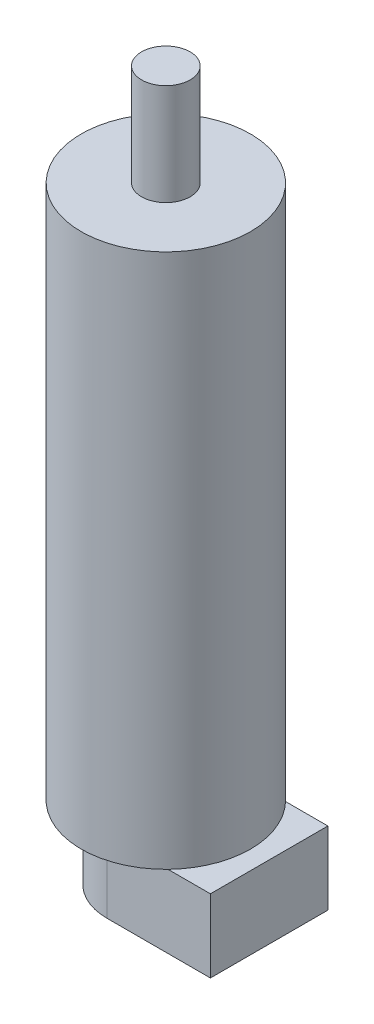
ISO-10303-21;
HEADER;
FILE_DESCRIPTION(('STEP AP214'),'2;1');
FILE_NAME('part.step','',(''),(''),'','','');
FILE_SCHEMA(('AUTOMOTIVE_DESIGN { 1 0 10303 214 1 1 1 1 }'));
ENDSEC;
DATA;
#1=APPLICATION_CONTEXT('core data for automotive mechanical design processes');
#2=APPLICATION_PROTOCOL_DEFINITION('international standard','automotive_design',2000,#1);
#3=PRODUCT_CONTEXT('',#1,'mechanical');
#4=PRODUCT('Part','Part','',(#3));
#5=PRODUCT_RELATED_PRODUCT_CATEGORY('part','',(#4));
#6=PRODUCT_DEFINITION_FORMATION('','',#4);
#7=PRODUCT_DEFINITION_CONTEXT('part definition',#1,'design');
#8=PRODUCT_DEFINITION('design','',#6,#7);
#9=PRODUCT_DEFINITION_SHAPE('','',#8);
#10=(LENGTH_UNIT() NAMED_UNIT(*) SI_UNIT(.MILLI.,.METRE.));
#11=(NAMED_UNIT(*) PLANE_ANGLE_UNIT() SI_UNIT($,.RADIAN.));
#12=(NAMED_UNIT(*) SI_UNIT($,.STERADIAN.) SOLID_ANGLE_UNIT());
#13=UNCERTAINTY_MEASURE_WITH_UNIT(LENGTH_MEASURE(1.E-05),#10,'distance_accuracy_value','');
#14=(GEOMETRIC_REPRESENTATION_CONTEXT(3) GLOBAL_UNCERTAINTY_ASSIGNED_CONTEXT((#13)) GLOBAL_UNIT_ASSIGNED_CONTEXT((#10,
#11,#12)) REPRESENTATION_CONTEXT('',''));
#15=CARTESIAN_POINT('',(0.,0.,0.));
#16=DIRECTION('',(0.,0.,1.));
#17=DIRECTION('',(1.,0.,0.));
#18=AXIS2_PLACEMENT_3D('',#15,#16,#17);
#19=CARTESIAN_POINT('',(-4.,-22.5,0.));
#20=DIRECTION('',(1.,0.,0.));
#21=DIRECTION('',(0.,0.,-1.));
#22=AXIS2_PLACEMENT_3D('',#19,#20,#21);
#23=PLANE('',#22);
#24=DIRECTION('',(0.,1.,0.));
#25=VECTOR('',#24,1.);
#26=CARTESIAN_POINT('',(-4.,-12.5,2.));
#27=LINE('',#26,#25);
#28=CARTESIAN_POINT('',(-4.,-20.5,2.));
#29=VERTEX_POINT('',#28);
#30=CARTESIAN_POINT('',(-4.,-4.5,2.));
#31=VERTEX_POINT('',#30);
#32=EDGE_CURVE('E99',#29,#31,#27,.T.);
#33=ORIENTED_EDGE('',*,*,#32,.T.);
#34=CARTESIAN_POINT('',(-4.,-4.5,0.));
#35=DIRECTION('',(-1.,0.,0.));
#36=DIRECTION('',(0.,0.,1.));
#37=AXIS2_PLACEMENT_3D('',#34,#35,#36);
#38=CIRCLE('',#37,2.);
#39=CARTESIAN_POINT('',(-4.,-4.5,-2.));
#40=VERTEX_POINT('',#39);
#41=EDGE_CURVE('E142',#31,#40,#38,.T.);
#42=ORIENTED_EDGE('',*,*,#41,.T.);
#43=DIRECTION('',(0.,1.,0.));
#44=VECTOR('',#43,1.);
#45=CARTESIAN_POINT('',(-4.,-12.5,-2.));
#46=LINE('',#45,#44);
#47=CARTESIAN_POINT('',(-4.,-20.5,-2.));
#48=VERTEX_POINT('',#47);
#49=EDGE_CURVE('E110',#48,#40,#46,.T.);
#50=ORIENTED_EDGE('',*,*,#49,.F.);
#51=CARTESIAN_POINT('',(-4.,-20.5,0.));
#52=DIRECTION('',(-1.,0.,0.));
#53=DIRECTION('',(0.,0.,1.));
#54=AXIS2_PLACEMENT_3D('',#51,#52,#53);
#55=CIRCLE('',#54,2.);
#56=EDGE_CURVE('E20',#48,#29,#55,.T.);
#57=ORIENTED_EDGE('',*,*,#56,.T.);
#58=EDGE_LOOP('',(#33,#42,#50,#57));
#59=FACE_BOUND('',#58,.T.);
#60=ADVANCED_FACE('F17',(#59),#23,.F.);
#61=CARTESIAN_POINT('',(8.04939564502272,-175.,0.));
#62=DIRECTION('',(0.,1.,0.));
#63=DIRECTION('',(0.,0.,1.));
#64=AXIS2_PLACEMENT_3D('',#61,#62,#63);
#65=PLANE('',#64);
#66=CARTESIAN_POINT('',(0.,-175.,0.));
#67=DIRECTION('',(0.,-1.,0.));
#68=DIRECTION('',(1.,0.,0.));
#69=AXIS2_PLACEMENT_3D('',#66,#67,#68);
#70=CIRCLE('',#69,14.5);
#71=CARTESIAN_POINT('',(0.,-175.,-14.5));
#72=VERTEX_POINT('',#71);
#73=CARTESIAN_POINT('',(0.,-175.,14.5));
#74=VERTEX_POINT('',#73);
#75=EDGE_CURVE('E272',#72,#74,#70,.F.);
#76=ORIENTED_EDGE('',*,*,#75,.F.);
#77=DIRECTION('',(-1.,0.,0.));
#78=VECTOR('',#77,1.);
#79=CARTESIAN_POINT('',(25.5,-175.,-14.5));
#80=LINE('',#79,#78);
#81=CARTESIAN_POINT('',(25.5,-175.,-14.5));
#82=VERTEX_POINT('',#81);
#83=EDGE_CURVE('E124',#82,#72,#80,.T.);
#84=ORIENTED_EDGE('',*,*,#83,.F.);
#85=DIRECTION('',(0.,0.,-1.));
#86=VECTOR('',#85,1.);
#87=CARTESIAN_POINT('',(25.5,-175.,14.5));
#88=LINE('',#87,#86);
#89=CARTESIAN_POINT('',(25.5,-175.,14.5));
#90=VERTEX_POINT('',#89);
#91=EDGE_CURVE('E136',#90,#82,#88,.T.);
#92=ORIENTED_EDGE('',*,*,#91,.F.);
#93=DIRECTION('',(1.,0.,0.));
#94=VECTOR('',#93,1.);
#95=CARTESIAN_POINT('',(0.,-175.,14.5));
#96=LINE('',#95,#94);
#97=EDGE_CURVE('E132',#74,#90,#96,.T.);
#98=ORIENTED_EDGE('',*,*,#97,.F.);
#99=EDGE_LOOP('',(#76,#84,#92,#98));
#100=FACE_BOUND('',#99,.T.);
#101=ADVANCED_FACE('F306',(#100),#65,.F.);
#102=CARTESIAN_POINT('',(-6.73306856241456,-12.5,2.));
#103=DIRECTION('',(0.,0.,1.));
#104=DIRECTION('',(1.,0.,0.));
#105=AXIS2_PLACEMENT_3D('',#102,#103,#104);
#106=PLANE('',#105);
#107=ORIENTED_EDGE('',*,*,#32,.F.);
#108=DIRECTION('',(-1.,0.,0.));
#109=VECTOR('',#108,1.);
#110=CARTESIAN_POINT('',(-8.09960284362183,-20.5,2.));
#111=LINE('',#110,#109);
#112=CARTESIAN_POINT('',(-5.65685424949237,-20.5,2.));
#113=VERTEX_POINT('',#112);
#114=EDGE_CURVE('E101',#29,#113,#111,.T.);
#115=ORIENTED_EDGE('',*,*,#114,.T.);
#116=DIRECTION('',(0.,-1.,0.));
#117=VECTOR('',#116,1.);
#118=CARTESIAN_POINT('',(-5.65685424949238,-12.5,2.));
#119=LINE('',#118,#117);
#120=CARTESIAN_POINT('',(-5.65685424949238,-4.5,2.));
#121=VERTEX_POINT('',#120);
#122=EDGE_CURVE('E264',#121,#113,#119,.T.);
#123=ORIENTED_EDGE('',*,*,#122,.F.);
#124=DIRECTION('',(-1.,0.,0.));
#125=VECTOR('',#124,1.);
#126=CARTESIAN_POINT('',(-5.36653428120728,-4.5,2.));
#127=LINE('',#126,#125);
#128=EDGE_CURVE('E104',#121,#31,#127,.F.);
#129=ORIENTED_EDGE('',*,*,#128,.T.);
#130=EDGE_LOOP('',(#107,#115,#123,#129));
#131=FACE_BOUND('',#130,.T.);
#132=ADVANCED_FACE('F100',(#131),#106,.F.);
#133=CARTESIAN_POINT('',(-8.09960284362183,-20.5,0.));
#134=DIRECTION('',(-1.,0.,0.));
#135=DIRECTION('',(0.,0.,1.));
#136=AXIS2_PLACEMENT_3D('',#133,#134,#135);
#137=CYLINDRICAL_SURFACE('',#136,2.);
#138=DIRECTION('',(1.,0.,0.));
#139=VECTOR('',#138,1.);
#140=CARTESIAN_POINT('',(-6.73306856241456,-20.5,-2.));
#141=LINE('',#140,#139);
#142=CARTESIAN_POINT('',(-5.65685424949237,-20.5,-2.));
#143=VERTEX_POINT('',#142);
#144=EDGE_CURVE('E113',#143,#48,#141,.T.);
#145=ORIENTED_EDGE('',*,*,#144,.F.);
#146=CARTESIAN_POINT('',(-5.65685424949237,-20.5,2.));
#147=CARTESIAN_POINT('',(-5.65684884179147,-20.554581043276,2.00000149375843));
#148=CARTESIAN_POINT('',(-5.65764520027123,-20.6091342237887,1.99776424451255));
#149=CARTESIAN_POINT('',(-5.66078655296454,-20.7178173659418,1.98885119435739));
#150=CARTESIAN_POINT('',(-5.66313112913611,-20.7719474378369,1.98217659159679));
#151=CARTESIAN_POINT('',(-5.67238186100911,-20.9327844796973,1.95562129980308));
#152=CARTESIAN_POINT('',(-5.68150585996211,-21.0383617859732,1.92920842248733));
#153=CARTESIAN_POINT('',(-5.70456166112211,-21.2432518654422,1.85991633491415));
#154=CARTESIAN_POINT('',(-5.71849088382529,-21.3425679659655,1.81704595785701));
#155=CARTESIAN_POINT('',(-5.74957624122923,-21.53268230939,1.71614472563144));
#156=CARTESIAN_POINT('',(-5.76673426277569,-21.623475524951,1.65810499804511));
#157=CARTESIAN_POINT('',(-5.80308799465943,-21.7974327100806,1.52610884181332));
#158=CARTESIAN_POINT('',(-5.82233419773289,-21.8802152014007,1.45166369414288));
#159=CARTESIAN_POINT('',(-5.86027369058978,-22.032399956906,1.28999145201007));
#160=CARTESIAN_POINT('',(-5.87896678315313,-22.1017974960141,1.20275986280909));
#161=CARTESIAN_POINT('',(-5.91428598942567,-22.2269881443538,1.01516592788934));
#162=CARTESIAN_POINT('',(-5.93084424167127,-22.2823722318204,0.914516988771549));
#163=CARTESIAN_POINT('',(-5.95940326071059,-22.3752206385709,0.704746567262076));
#164=CARTESIAN_POINT('',(-5.97140961667464,-22.4127069489016,0.595635674808582));
#165=CARTESIAN_POINT('',(-5.98683877140557,-22.4602475410318,0.405040536436658));
#166=CARTESIAN_POINT('',(-5.99174657627997,-22.475123920689,0.324846609487065));
#167=CARTESIAN_POINT('',(-5.99832834221425,-22.4950015875116,0.163111840880364));
#168=CARTESIAN_POINT('',(-6.00000248277622,-22.5000034228174,0.0815710742403433));
#169=CARTESIAN_POINT('',(-5.99999668076366,-22.4999954240178,-0.109052789280185));
#170=CARTESIAN_POINT('',(-5.99699670684628,-22.4910448732045,-0.218159747800598));
#171=CARTESIAN_POINT('',(-5.98531165061163,-22.4555629807985,-0.433213016519224));
#172=CARTESIAN_POINT('',(-5.97662173323894,-22.4290166869064,-0.539156558461215));
#173=CARTESIAN_POINT('',(-5.95450524812733,-22.3593590956721,-0.74466935491201));
#174=CARTESIAN_POINT('',(-5.94108809701935,-22.3162807150683,-0.84425082015528));
#175=CARTESIAN_POINT('',(-5.91088699350148,-22.2149108040547,-1.03476127570407));
#176=CARTESIAN_POINT('',(-5.89410277426667,-22.1566180678657,-1.12568957944319));
#177=CARTESIAN_POINT('',(-5.85828241386193,-22.0243504992917,-1.2994805717371));
#178=CARTESIAN_POINT('',(-5.83919229222969,-21.9499425405013,-1.38200242703585));
#179=CARTESIAN_POINT('',(-5.80120734240528,-21.7884700724964,-1.53366153903484));
#180=CARTESIAN_POINT('',(-5.78231256995808,-21.7014020518569,-1.60279506987144));
#181=CARTESIAN_POINT('',(-5.74626041003988,-21.5139988371862,-1.72767175144752));
#182=CARTESIAN_POINT('',(-5.72916954418607,-21.4133514041937,-1.78296692362324));
#183=CARTESIAN_POINT('',(-5.69949629987982,-21.2035601745916,-1.87566629037053));
#184=CARTESIAN_POINT('',(-5.68690937859231,-21.0944250750028,-1.91308852503714));
#185=CARTESIAN_POINT('',(-5.67072104665874,-20.9040027414,-1.96044949514537));
#186=CARTESIAN_POINT('',(-5.66556318486902,-20.8240239074553,-1.97524301676809));
#187=CARTESIAN_POINT('',(-5.65861074103287,-20.6627153694485,-1.99503214763902));
#188=CARTESIAN_POINT('',(-5.65681646587319,-20.5813855428074,-2.00002686286613));
#189=CARTESIAN_POINT('',(-5.65685424949237,-20.5,-2.));
#190=B_SPLINE_CURVE_WITH_KNOTS('',3,(#146,#147,#148,#149,#150,#151,#152,#153,#154,#155,#156,
#157,#158,#159,#160,#161,#162,#163,#164,#165,#166,#167,#168,#169,#170,#171,#172,#173,#174,#175,
#176,#177,#178,#179,#180,#181,#182,#183,#184,#185,#186,#187,#188,#189),.UNSPECIFIED.,.F.,.F.,(4,
2,2,2,2,2,2,2,2,2,2,2,2,2,2,2,2,2,2,2,2,4),(0.,0.16363711848162,0.327230070545711,
0.653162397592184,0.978920031678614,1.30486862655436,1.64230066113897,1.9798515968479,
2.32634313894962,2.67240784330359,2.91690557900246,3.16138974213691,3.48824187903641,
3.81537212111244,4.14185437137159,4.46836250409952,4.80507367423103,5.14187841415668,
5.48847983044704,5.83473066046781,6.07859129287806,6.32247417355028),.UNSPECIFIED.);
#191=EDGE_CURVE('E116',#113,#143,#190,.T.);
#192=ORIENTED_EDGE('',*,*,#191,.F.);
#193=ORIENTED_EDGE('',*,*,#114,.F.);
#194=ORIENTED_EDGE('',*,*,#56,.F.);
#195=EDGE_LOOP('',(#145,#192,#193,#194));
#196=FACE_BOUND('',#195,.T.);
#197=ADVANCED_FACE('F114',(#196),#137,.F.);
#198=CARTESIAN_POINT('',(-6.73306856241456,-12.5,-2.));
#199=DIRECTION('',(0.,0.,1.));
#200=DIRECTION('',(1.,0.,0.));
#201=AXIS2_PLACEMENT_3D('',#198,#199,#200);
#202=PLANE('',#201);
#203=DIRECTION('',(-1.,0.,0.));
#204=VECTOR('',#203,1.);
#205=CARTESIAN_POINT('',(-5.36653428120728,-4.5,-2.));
#206=LINE('',#205,#204);
#207=CARTESIAN_POINT('',(-5.65685424949238,-4.5,-2.));
#208=VERTEX_POINT('',#207);
#209=EDGE_CURVE('E146',#40,#208,#206,.T.);
#210=ORIENTED_EDGE('',*,*,#209,.T.);
#211=DIRECTION('',(0.,-1.,0.));
#212=VECTOR('',#211,1.);
#213=CARTESIAN_POINT('',(-5.65685424949238,-12.5,-2.));
#214=LINE('',#213,#212);
#215=EDGE_CURVE('E177',#143,#208,#214,.F.);
#216=ORIENTED_EDGE('',*,*,#215,.F.);
#217=ORIENTED_EDGE('',*,*,#144,.T.);
#218=ORIENTED_EDGE('',*,*,#49,.T.);
#219=EDGE_LOOP('',(#210,#216,#217,#218));
#220=FACE_BOUND('',#219,.T.);
#221=ADVANCED_FACE('F218',(#220),#202,.T.);
#222=CARTESIAN_POINT('',(-5.36653428120728,-4.5,0.));
#223=DIRECTION('',(-1.,0.,0.));
#224=DIRECTION('',(0.,0.,1.));
#225=AXIS2_PLACEMENT_3D('',#222,#223,#224);
#226=CYLINDRICAL_SURFACE('',#225,2.);
#227=ORIENTED_EDGE('',*,*,#128,.F.);
#228=CARTESIAN_POINT('',(-5.65685424949238,-4.5,-2.));
#229=CARTESIAN_POINT('',(-5.65684884179147,-4.44541895672398,-2.00000149375843));
#230=CARTESIAN_POINT('',(-5.65764520027123,-4.39086577621134,-1.99776424451255));
#231=CARTESIAN_POINT('',(-5.66078655296455,-4.28218263405823,-1.98885119435739));
#232=CARTESIAN_POINT('',(-5.66313112913611,-4.22805256216313,-1.98217659159678));
#233=CARTESIAN_POINT('',(-5.67238186100911,-4.06721552030272,-1.95562129980308));
#234=CARTESIAN_POINT('',(-5.68150585996212,-3.96163821402684,-1.92920842248733));
#235=CARTESIAN_POINT('',(-5.70456166112212,-3.75674813455779,-1.85991633491415));
#236=CARTESIAN_POINT('',(-5.7184908838253,-3.65743203403455,-1.81704595785701));
#237=CARTESIAN_POINT('',(-5.74957624122923,-3.46731769061003,-1.71614472563143));
#238=CARTESIAN_POINT('',(-5.76673426277569,-3.37652447504903,-1.65810499804511));
#239=CARTESIAN_POINT('',(-5.80308799465943,-3.20256728991935,-1.52610884181331));
#240=CARTESIAN_POINT('',(-5.8223341977329,-3.11978479859934,-1.45166369414288));
#241=CARTESIAN_POINT('',(-5.86027369058979,-2.96760004309403,-1.28999145201007));
#242=CARTESIAN_POINT('',(-5.87896678315314,-2.89820250398592,-1.20275986280908));
#243=CARTESIAN_POINT('',(-5.91428598942568,-2.77301185564616,-1.01516592788933));
#244=CARTESIAN_POINT('',(-5.93084424167127,-2.71762776817957,-0.914516988771544));
#245=CARTESIAN_POINT('',(-5.95940326071059,-2.62477936142906,-0.704746567262071));
#246=CARTESIAN_POINT('',(-5.97140961667465,-2.58729305109839,-0.595635674808576));
#247=CARTESIAN_POINT('',(-5.98683877140557,-2.53975245896824,-0.405040536436653));
#248=CARTESIAN_POINT('',(-5.99174657627998,-2.52487607931099,-0.324846609487061));
#249=CARTESIAN_POINT('',(-5.99832834221426,-2.50499841248844,-0.163111840880362));
#250=CARTESIAN_POINT('',(-6.00000248277623,-2.49999657718262,-0.0815710742403418));
#251=CARTESIAN_POINT('',(-5.99999668076367,-2.50000457598219,0.109052789280186));
#252=CARTESIAN_POINT('',(-5.99699670684629,-2.50895512679546,0.218159747800599));
#253=CARTESIAN_POINT('',(-5.98531165061164,-2.54443701920154,0.433213016519224));
#254=CARTESIAN_POINT('',(-5.97662173323894,-2.57098331309363,0.539156558461216));
#255=CARTESIAN_POINT('',(-5.95450524812733,-2.64064090432792,0.74466935491201));
#256=CARTESIAN_POINT('',(-5.94108809701936,-2.68371928493169,0.84425082015528));
#257=CARTESIAN_POINT('',(-5.91088699350149,-2.78508919594529,1.03476127570407));
#258=CARTESIAN_POINT('',(-5.89410277426667,-2.84338193213425,1.12568957944319));
#259=CARTESIAN_POINT('',(-5.85828241386194,-2.97564950070831,1.2994805717371));
#260=CARTESIAN_POINT('',(-5.8391922922297,-3.05005745949872,1.38200242703585));
#261=CARTESIAN_POINT('',(-5.80120734240529,-3.21152992750359,1.53366153903484));
#262=CARTESIAN_POINT('',(-5.78231256995809,-3.29859794814308,1.60279506987144));
#263=CARTESIAN_POINT('',(-5.74626041003988,-3.48600116281379,1.72767175144752));
#264=CARTESIAN_POINT('',(-5.72916954418608,-3.58664859580632,1.78296692362324));
#265=CARTESIAN_POINT('',(-5.69949629987983,-3.79643982540843,1.87566629037053));
#266=CARTESIAN_POINT('',(-5.68690937859231,-3.90557492499725,1.91308852503714));
#267=CARTESIAN_POINT('',(-5.67072104665874,-4.09599725860004,1.96044949514537));
#268=CARTESIAN_POINT('',(-5.66556318486903,-4.17597609254466,1.97524301676809));
#269=CARTESIAN_POINT('',(-5.65861074103288,-4.3372846305515,1.99503214763902));
#270=CARTESIAN_POINT('',(-5.6568164658732,-4.41861445719262,2.00002686286613));
#271=CARTESIAN_POINT('',(-5.65685424949238,-4.5,2.));
#272=B_SPLINE_CURVE_WITH_KNOTS('',3,(#228,#229,#230,#231,#232,#233,#234,#235,#236,#237,#238,
#239,#240,#241,#242,#243,#244,#245,#246,#247,#248,#249,#250,#251,#252,#253,#254,#255,#256,#257,
#258,#259,#260,#261,#262,#263,#264,#265,#266,#267,#268,#269,#270,#271),.UNSPECIFIED.,.F.,.F.,(4,
2,2,2,2,2,2,2,2,2,2,2,2,2,2,2,2,2,2,2,2,4),(0.,0.163637118481622,0.327230070545714,
0.653162397592185,0.978920031678612,1.30486862655436,1.64230066113898,1.9798515968479,
2.32634313894963,2.67240784330359,2.91690557900246,3.16138974213691,3.4882418790364,
3.81537212111244,4.14185437137159,4.46836250409951,4.80507367423102,5.14187841415668,
5.48847983044704,5.83473066046781,6.07859129287806,6.32247417355027),.UNSPECIFIED.);
#273=EDGE_CURVE('E168',#208,#121,#272,.T.);
#274=ORIENTED_EDGE('',*,*,#273,.F.);
#275=ORIENTED_EDGE('',*,*,#209,.F.);
#276=ORIENTED_EDGE('',*,*,#41,.F.);
#277=EDGE_LOOP('',(#227,#274,#275,#276));
#278=FACE_BOUND('',#277,.T.);
#279=ADVANCED_FACE('F183',(#278),#226,.F.);
#280=CARTESIAN_POINT('',(3.,0.,0.));
#281=DIRECTION('',(0.,1.,0.));
#282=DIRECTION('',(0.,0.,1.));
#283=AXIS2_PLACEMENT_3D('',#280,#281,#282);
#284=PLANE('',#283);
#285=CARTESIAN_POINT('',(0.,0.,0.));
#286=DIRECTION('',(0.,-1.,0.));
#287=DIRECTION('',(1.,0.,0.));
#288=AXIS2_PLACEMENT_3D('',#285,#286,#287);
#289=CIRCLE('',#288,6.);
#290=CARTESIAN_POINT('',(6.,0.,0.));
#291=VERTEX_POINT('',#290);
#292=EDGE_CURVE('E163',#291,#291,#289,.T.);
#293=ORIENTED_EDGE('',*,*,#292,.F.);
#294=EDGE_LOOP('',(#293));
#295=FACE_BOUND('',#294,.T.);
#296=ADVANCED_FACE('F209',(#295),#284,.T.);
#297=CARTESIAN_POINT('',(25.5,-157.,14.5));
#298=DIRECTION('',(1.,0.,0.));
#299=DIRECTION('',(0.,0.,-1.));
#300=AXIS2_PLACEMENT_3D('',#297,#298,#299);
#301=PLANE('',#300);
#302=DIRECTION('',(0.,0.,1.));
#303=VECTOR('',#302,1.);
#304=CARTESIAN_POINT('',(25.5,-157.,0.));
#305=LINE('',#304,#303);
#306=CARTESIAN_POINT('',(25.5,-157.,14.5));
#307=VERTEX_POINT('',#306);
#308=CARTESIAN_POINT('',(25.5,-157.,-14.5));
#309=VERTEX_POINT('',#308);
#310=EDGE_CURVE('E253',#307,#309,#305,.F.);
#311=ORIENTED_EDGE('',*,*,#310,.F.);
#312=DIRECTION('',(0.,1.,0.));
#313=VECTOR('',#312,1.);
#314=CARTESIAN_POINT('',(25.5,-157.,14.5));
#315=LINE('',#314,#313);
#316=EDGE_CURVE('E129',#90,#307,#315,.T.);
#317=ORIENTED_EDGE('',*,*,#316,.F.);
#318=ORIENTED_EDGE('',*,*,#91,.T.);
#319=DIRECTION('',(0.,1.,0.));
#320=VECTOR('',#319,1.);
#321=CARTESIAN_POINT('',(25.5,-157.,-14.5));
#322=LINE('',#321,#320);
#323=EDGE_CURVE('E128',#309,#82,#322,.F.);
#324=ORIENTED_EDGE('',*,*,#323,.F.);
#325=EDGE_LOOP('',(#311,#317,#318,#324));
#326=FACE_BOUND('',#325,.T.);
#327=ADVANCED_FACE('F206',(#326),#301,.T.);
#328=CARTESIAN_POINT('',(0.,-157.,14.5));
#329=DIRECTION('',(0.,0.,1.));
#330=DIRECTION('',(1.,0.,0.));
#331=AXIS2_PLACEMENT_3D('',#328,#329,#330);
#332=PLANE('',#331);
#333=DIRECTION('',(1.,0.,0.));
#334=VECTOR('',#333,1.);
#335=CARTESIAN_POINT('',(10.45,-157.,14.5));
#336=LINE('',#335,#334);
#337=CARTESIAN_POINT('',(0.,-157.,14.5));
#338=VERTEX_POINT('',#337);
#339=CARTESIAN_POINT('',(15.0519101777815,-157.,14.5));
#340=VERTEX_POINT('',#339);
#341=EDGE_CURVE('E244',#338,#340,#336,.T.);
#342=ORIENTED_EDGE('',*,*,#341,.F.);
#343=DIRECTION('',(0.,-1.,0.));
#344=VECTOR('',#343,1.);
#345=CARTESIAN_POINT('',(0.,-157.,14.5));
#346=LINE('',#345,#344);
#347=EDGE_CURVE('E268',#74,#338,#346,.F.);
#348=ORIENTED_EDGE('',*,*,#347,.F.);
#349=ORIENTED_EDGE('',*,*,#97,.T.);
#350=ORIENTED_EDGE('',*,*,#316,.T.);
#351=DIRECTION('',(1.,0.,0.));
#352=VECTOR('',#351,1.);
#353=CARTESIAN_POINT('',(8.04939564502272,-157.,14.5));
#354=LINE('',#353,#352);
#355=EDGE_CURVE('E167',#340,#307,#354,.T.);
#356=ORIENTED_EDGE('',*,*,#355,.F.);
#357=EDGE_LOOP('',(#342,#348,#349,#350,#356));
#358=FACE_BOUND('',#357,.T.);
#359=ADVANCED_FACE('F203',(#358),#332,.T.);
#360=CARTESIAN_POINT('',(25.5,-157.,-14.5));
#361=DIRECTION('',(0.,0.,-1.));
#362=DIRECTION('',(-1.,0.,0.));
#363=AXIS2_PLACEMENT_3D('',#360,#361,#362);
#364=PLANE('',#363);
#365=DIRECTION('',(1.,0.,0.));
#366=VECTOR('',#365,1.);
#367=CARTESIAN_POINT('',(8.04939564502272,-157.,-14.5));
#368=LINE('',#367,#366);
#369=CARTESIAN_POINT('',(15.0519101777815,-157.,-14.5));
#370=VERTEX_POINT('',#369);
#371=EDGE_CURVE('E249',#309,#370,#368,.F.);
#372=ORIENTED_EDGE('',*,*,#371,.F.);
#373=ORIENTED_EDGE('',*,*,#323,.T.);
#374=ORIENTED_EDGE('',*,*,#83,.T.);
#375=DIRECTION('',(0.,-1.,0.));
#376=VECTOR('',#375,1.);
#377=CARTESIAN_POINT('',(0.,-157.,-14.5));
#378=LINE('',#377,#376);
#379=CARTESIAN_POINT('',(0.,-157.,-14.5));
#380=VERTEX_POINT('',#379);
#381=EDGE_CURVE('E267',#380,#72,#378,.T.);
#382=ORIENTED_EDGE('',*,*,#381,.F.);
#383=DIRECTION('',(1.,0.,0.));
#384=VECTOR('',#383,1.);
#385=CARTESIAN_POINT('',(10.45,-157.,-14.5));
#386=LINE('',#385,#384);
#387=EDGE_CURVE('E40',#370,#380,#386,.F.);
#388=ORIENTED_EDGE('',*,*,#387,.F.);
#389=EDGE_LOOP('',(#372,#373,#374,#382,#388));
#390=FACE_BOUND('',#389,.T.);
#391=ADVANCED_FACE('F199',(#390),#364,.T.);
#392=CARTESIAN_POINT('',(0.,-157.,0.));
#393=DIRECTION('',(0.,-1.,0.));
#394=DIRECTION('',(1.,0.,0.));
#395=AXIS2_PLACEMENT_3D('',#392,#393,#394);
#396=CYLINDRICAL_SURFACE('',#395,14.5);
#397=CARTESIAN_POINT('',(0.,-157.,0.));
#398=DIRECTION('',(0.,-1.,0.));
#399=DIRECTION('',(1.,0.,0.));
#400=AXIS2_PLACEMENT_3D('',#397,#398,#399);
#401=CIRCLE('',#400,14.5);
#402=EDGE_CURVE('E159',#380,#338,#401,.F.);
#403=ORIENTED_EDGE('',*,*,#402,.F.);
#404=ORIENTED_EDGE('',*,*,#381,.T.);
#405=ORIENTED_EDGE('',*,*,#75,.T.);
#406=ORIENTED_EDGE('',*,*,#347,.T.);
#407=EDGE_LOOP('',(#403,#404,#405,#406));
#408=FACE_BOUND('',#407,.T.);
#409=ADVANCED_FACE('F193',(#408),#396,.T.);
#410=CARTESIAN_POINT('',(0.,-12.5,0.));
#411=DIRECTION('',(0.,-1.,0.));
#412=DIRECTION('',(1.,0.,0.));
#413=AXIS2_PLACEMENT_3D('',#410,#411,#412);
#414=CYLINDRICAL_SURFACE('',#413,6.);
#415=ORIENTED_EDGE('',*,*,#292,.T.);
#416=EDGE_LOOP('',(#415));
#417=FACE_BOUND('',#416,.T.);
#418=ORIENTED_EDGE('',*,*,#215,.T.);
#419=ORIENTED_EDGE('',*,*,#273,.T.);
#420=ORIENTED_EDGE('',*,*,#122,.T.);
#421=ORIENTED_EDGE('',*,*,#191,.T.);
#422=EDGE_LOOP('',(#418,#419,#420,#421));
#423=FACE_BOUND('',#422,.T.);
#424=CARTESIAN_POINT('',(0.,-25.,0.));
#425=DIRECTION('',(0.,-1.,0.));
#426=DIRECTION('',(1.,0.,0.));
#427=AXIS2_PLACEMENT_3D('',#424,#425,#426);
#428=CIRCLE('',#427,6.);
#429=CARTESIAN_POINT('',(6.00000000000001,-25.,0.));
#430=VERTEX_POINT('',#429);
#431=EDGE_CURVE('E155',#430,#430,#428,.T.);
#432=ORIENTED_EDGE('',*,*,#431,.F.);
#433=EDGE_LOOP('',(#432));
#434=FACE_BOUND('',#433,.T.);
#435=ADVANCED_FACE('F187',(#417,#423,#434),#414,.T.);
#436=CARTESIAN_POINT('',(8.04939564502272,-157.,0.));
#437=DIRECTION('',(0.,1.,0.));
#438=DIRECTION('',(0.,0.,1.));
#439=AXIS2_PLACEMENT_3D('',#436,#437,#438);
#440=PLANE('',#439);
#441=ORIENTED_EDGE('',*,*,#310,.T.);
#442=ORIENTED_EDGE('',*,*,#371,.T.);
#443=CARTESIAN_POINT('',(0.,-157.,0.));
#444=DIRECTION('',(0.,-1.,0.));
#445=DIRECTION('',(1.,0.,0.));
#446=AXIS2_PLACEMENT_3D('',#443,#444,#445);
#447=CIRCLE('',#446,20.9);
#448=EDGE_CURVE('E151',#340,#370,#447,.F.);
#449=ORIENTED_EDGE('',*,*,#448,.F.);
#450=ORIENTED_EDGE('',*,*,#355,.T.);
#451=EDGE_LOOP('',(#441,#442,#449,#450));
#452=FACE_BOUND('',#451,.T.);
#453=ADVANCED_FACE('F192',(#452),#440,.T.);
#454=CARTESIAN_POINT('',(10.45,-157.,0.));
#455=DIRECTION('',(0.,-1.,0.));
#456=DIRECTION('',(0.,0.,-1.));
#457=AXIS2_PLACEMENT_3D('',#454,#455,#456);
#458=PLANE('',#457);
#459=ORIENTED_EDGE('',*,*,#387,.T.);
#460=ORIENTED_EDGE('',*,*,#402,.T.);
#461=ORIENTED_EDGE('',*,*,#341,.T.);
#462=CARTESIAN_POINT('',(0.,-157.,0.));
#463=DIRECTION('',(0.,-1.,0.));
#464=DIRECTION('',(1.,0.,0.));
#465=AXIS2_PLACEMENT_3D('',#462,#463,#464);
#466=CIRCLE('',#465,20.9);
#467=EDGE_CURVE('E27',#370,#340,#466,.F.);
#468=ORIENTED_EDGE('',*,*,#467,.F.);
#469=EDGE_LOOP('',(#459,#460,#461,#468));
#470=FACE_BOUND('',#469,.T.);
#471=ADVANCED_FACE('F229',(#470),#458,.T.);
#472=CARTESIAN_POINT('',(13.45,-25.,0.));
#473=DIRECTION('',(0.,1.,0.));
#474=DIRECTION('',(0.,0.,1.));
#475=AXIS2_PLACEMENT_3D('',#472,#473,#474);
#476=PLANE('',#475);
#477=ORIENTED_EDGE('',*,*,#431,.T.);
#478=EDGE_LOOP('',(#477));
#479=FACE_BOUND('',#478,.T.);
#480=CARTESIAN_POINT('',(0.,-25.,0.));
#481=DIRECTION('',(0.,-1.,0.));
#482=DIRECTION('',(1.,0.,0.));
#483=AXIS2_PLACEMENT_3D('',#480,#481,#482);
#484=CIRCLE('',#483,20.9);
#485=CARTESIAN_POINT('',(20.9,-25.,0.));
#486=VERTEX_POINT('',#485);
#487=EDGE_CURVE('E11',#486,#486,#484,.T.);
#488=ORIENTED_EDGE('',*,*,#487,.F.);
#489=EDGE_LOOP('',(#488));
#490=FACE_BOUND('',#489,.T.);
#491=ADVANCED_FACE('F223',(#479,#490),#476,.T.);
#492=CARTESIAN_POINT('',(0.,-91.,0.));
#493=DIRECTION('',(0.,-1.,0.));
#494=DIRECTION('',(1.,0.,0.));
#495=AXIS2_PLACEMENT_3D('',#492,#493,#494);
#496=CYLINDRICAL_SURFACE('',#495,20.9);
#497=ORIENTED_EDGE('',*,*,#487,.T.);
#498=EDGE_LOOP('',(#497));
#499=FACE_BOUND('',#498,.T.);
#500=ORIENTED_EDGE('',*,*,#448,.T.);
#501=ORIENTED_EDGE('',*,*,#467,.T.);
#502=EDGE_LOOP('',(#500,#501));
#503=FACE_BOUND('',#502,.T.);
#504=ADVANCED_FACE('F221',(#499,#503),#496,.T.);
#505=CLOSED_SHELL('',(#60,#101,#132,#197,#221,#279,#296,#327,#359,#391,#409,#435,#453,#471,#491,#504));
#506=MANIFOLD_SOLID_BREP('B1',#505);
#507=ADVANCED_BREP_SHAPE_REPRESENTATION('',(#18,#506),#14);
#508=SHAPE_DEFINITION_REPRESENTATION(#9,#507);
ENDSEC;
END-ISO-10303-21;
